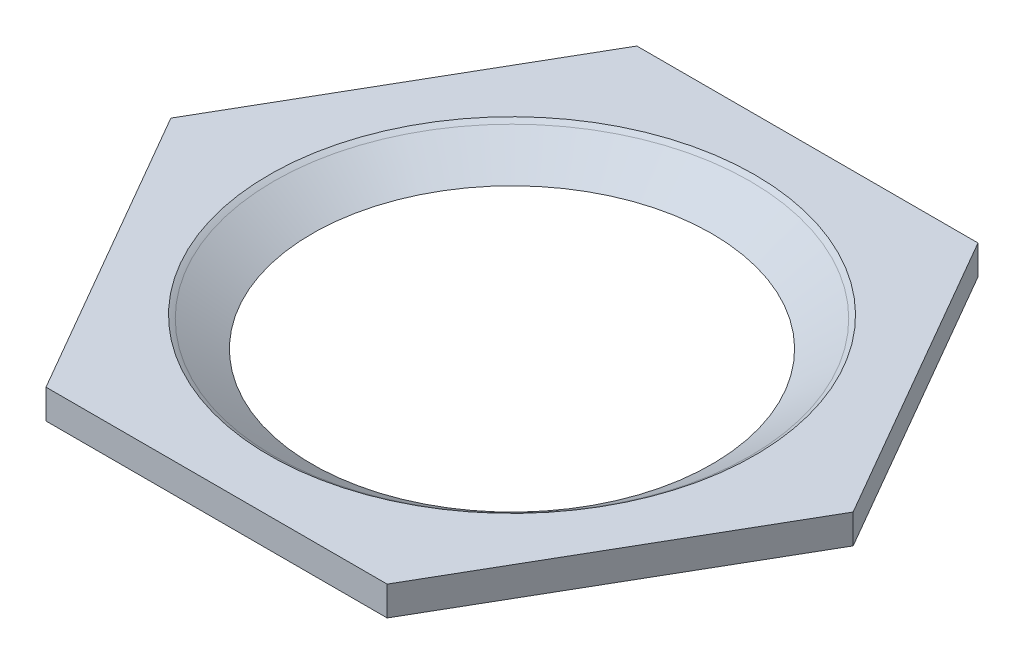
ISO-10303-21;
HEADER;
FILE_DESCRIPTION(('STEP AP214'),'2;1');
FILE_NAME('part.step','',(''),(''),'','','');
FILE_SCHEMA(('AUTOMOTIVE_DESIGN { 1 0 10303 214 1 1 1 1 }'));
ENDSEC;
DATA;
#1=APPLICATION_CONTEXT('core data for automotive mechanical design processes');
#2=APPLICATION_PROTOCOL_DEFINITION('international standard','automotive_design',2000,#1);
#3=PRODUCT_CONTEXT('',#1,'mechanical');
#4=PRODUCT('Part','Part','',(#3));
#5=PRODUCT_RELATED_PRODUCT_CATEGORY('part','',(#4));
#6=PRODUCT_DEFINITION_FORMATION('','',#4);
#7=PRODUCT_DEFINITION_CONTEXT('part definition',#1,'design');
#8=PRODUCT_DEFINITION('design','',#6,#7);
#9=PRODUCT_DEFINITION_SHAPE('','',#8);
#10=(LENGTH_UNIT() NAMED_UNIT(*) SI_UNIT(.MILLI.,.METRE.));
#11=(NAMED_UNIT(*) PLANE_ANGLE_UNIT() SI_UNIT($,.RADIAN.));
#12=(NAMED_UNIT(*) SI_UNIT($,.STERADIAN.) SOLID_ANGLE_UNIT());
#13=UNCERTAINTY_MEASURE_WITH_UNIT(LENGTH_MEASURE(1.E-05),#10,'distance_accuracy_value','');
#14=(GEOMETRIC_REPRESENTATION_CONTEXT(3) GLOBAL_UNCERTAINTY_ASSIGNED_CONTEXT((#13)) GLOBAL_UNIT_ASSIGNED_CONTEXT((#10,
#11,#12)) REPRESENTATION_CONTEXT('',''));
#15=CARTESIAN_POINT('',(0.,0.,0.));
#16=DIRECTION('',(0.,0.,1.));
#17=DIRECTION('',(1.,0.,0.));
#18=AXIS2_PLACEMENT_3D('',#15,#16,#17);
#19=CARTESIAN_POINT('',(11.0718461122495,66.3956,-19.177));
#20=DIRECTION('',(-0.866025403784439,0.,0.5));
#21=DIRECTION('',(0.5,0.,0.866025403784439));
#22=AXIS2_PLACEMENT_3D('',#19,#20,#21);
#23=PLANE('',#22);
#24=DIRECTION('',(-0.5,0.,-0.866025403784439));
#25=VECTOR('',#24,1.);
#26=CARTESIAN_POINT('',(11.0718461122495,64.4906,-19.177));
#27=LINE('',#26,#25);
#28=CARTESIAN_POINT('',(22.1436922244989,64.4906,0.));
#29=VERTEX_POINT('',#28);
#30=CARTESIAN_POINT('',(11.0718461122495,64.4906,-19.177));
#31=VERTEX_POINT('',#30);
#32=EDGE_CURVE('E127',#29,#31,#27,.T.);
#33=ORIENTED_EDGE('',*,*,#32,.T.);
#34=DIRECTION('',(0.,-1.,0.));
#35=VECTOR('',#34,1.);
#36=CARTESIAN_POINT('',(11.0718461122495,66.3956,-19.177));
#37=LINE('',#36,#35);
#38=CARTESIAN_POINT('',(11.0718461122495,66.3956,-19.177));
#39=VERTEX_POINT('',#38);
#40=EDGE_CURVE('E11',#39,#31,#37,.T.);
#41=ORIENTED_EDGE('',*,*,#40,.F.);
#42=DIRECTION('',(-0.5,0.,-0.866025403784439));
#43=VECTOR('',#42,1.);
#44=CARTESIAN_POINT('',(11.0718461122495,66.3956,-19.177));
#45=LINE('',#44,#43);
#46=CARTESIAN_POINT('',(22.1436922244989,66.3956,0.));
#47=VERTEX_POINT('',#46);
#48=EDGE_CURVE('E138',#47,#39,#45,.T.);
#49=ORIENTED_EDGE('',*,*,#48,.F.);
#50=DIRECTION('',(0.,-1.,0.));
#51=VECTOR('',#50,1.);
#52=CARTESIAN_POINT('',(22.1436922244989,66.3956,0.));
#53=LINE('',#52,#51);
#54=EDGE_CURVE('E123',#47,#29,#53,.T.);
#55=ORIENTED_EDGE('',*,*,#54,.T.);
#56=EDGE_LOOP('',(#33,#41,#49,#55));
#57=FACE_BOUND('',#56,.T.);
#58=ADVANCED_FACE('F43',(#57),#23,.F.);
#59=CARTESIAN_POINT('',(-11.0718461122495,66.3956,-19.177));
#60=DIRECTION('',(0.,0.,1.));
#61=DIRECTION('',(1.,0.,0.));
#62=AXIS2_PLACEMENT_3D('',#59,#60,#61);
#63=PLANE('',#62);
#64=DIRECTION('',(-1.,0.,0.));
#65=VECTOR('',#64,1.);
#66=CARTESIAN_POINT('',(-11.0718461122495,64.4906,-19.177));
#67=LINE('',#66,#65);
#68=CARTESIAN_POINT('',(-11.0718461122495,64.4906,-19.177));
#69=VERTEX_POINT('',#68);
#70=EDGE_CURVE('E130',#31,#69,#67,.T.);
#71=ORIENTED_EDGE('',*,*,#70,.T.);
#72=DIRECTION('',(0.,-1.,0.));
#73=VECTOR('',#72,1.);
#74=CARTESIAN_POINT('',(-11.0718461122495,66.3956,-19.177));
#75=LINE('',#74,#73);
#76=CARTESIAN_POINT('',(-11.0718461122495,66.3956,-19.177));
#77=VERTEX_POINT('',#76);
#78=EDGE_CURVE('E51',#77,#69,#75,.T.);
#79=ORIENTED_EDGE('',*,*,#78,.F.);
#80=DIRECTION('',(-1.,0.,0.));
#81=VECTOR('',#80,1.);
#82=CARTESIAN_POINT('',(-11.0718461122495,66.3956,-19.177));
#83=LINE('',#82,#81);
#84=EDGE_CURVE('E96',#39,#77,#83,.T.);
#85=ORIENTED_EDGE('',*,*,#84,.F.);
#86=ORIENTED_EDGE('',*,*,#40,.T.);
#87=EDGE_LOOP('',(#71,#79,#85,#86));
#88=FACE_BOUND('',#87,.T.);
#89=ADVANCED_FACE('F163',(#88),#63,.F.);
#90=CARTESIAN_POINT('',(-22.1436922244989,66.3956,0.));
#91=DIRECTION('',(0.866025403784439,0.,0.5));
#92=DIRECTION('',(0.5,0.,-0.866025403784439));
#93=AXIS2_PLACEMENT_3D('',#90,#91,#92);
#94=PLANE('',#93);
#95=DIRECTION('',(-0.5,0.,0.866025403784439));
#96=VECTOR('',#95,1.);
#97=CARTESIAN_POINT('',(-22.1436922244989,64.4906,0.));
#98=LINE('',#97,#96);
#99=CARTESIAN_POINT('',(-22.1436922244989,64.4906,0.));
#100=VERTEX_POINT('',#99);
#101=EDGE_CURVE('E133',#69,#100,#98,.T.);
#102=ORIENTED_EDGE('',*,*,#101,.T.);
#103=DIRECTION('',(0.,-1.,0.));
#104=VECTOR('',#103,1.);
#105=CARTESIAN_POINT('',(-22.1436922244989,66.3956,0.));
#106=LINE('',#105,#104);
#107=CARTESIAN_POINT('',(-22.1436922244989,66.3956,0.));
#108=VERTEX_POINT('',#107);
#109=EDGE_CURVE('E118',#108,#100,#106,.T.);
#110=ORIENTED_EDGE('',*,*,#109,.F.);
#111=DIRECTION('',(-0.5,0.,0.866025403784439));
#112=VECTOR('',#111,1.);
#113=CARTESIAN_POINT('',(-22.1436922244989,66.3956,0.));
#114=LINE('',#113,#112);
#115=EDGE_CURVE('E109',#77,#108,#114,.T.);
#116=ORIENTED_EDGE('',*,*,#115,.F.);
#117=ORIENTED_EDGE('',*,*,#78,.T.);
#118=EDGE_LOOP('',(#102,#110,#116,#117));
#119=FACE_BOUND('',#118,.T.);
#120=ADVANCED_FACE('F144',(#119),#94,.F.);
#121=CARTESIAN_POINT('',(-11.0718461122494,66.3956,19.177));
#122=DIRECTION('',(0.866025403784439,0.,-0.5));
#123=DIRECTION('',(-0.5,0.,-0.866025403784439));
#124=AXIS2_PLACEMENT_3D('',#121,#122,#123);
#125=PLANE('',#124);
#126=DIRECTION('',(0.5,0.,0.866025403784439));
#127=VECTOR('',#126,1.);
#128=CARTESIAN_POINT('',(-11.0718461122494,64.4906,19.177));
#129=LINE('',#128,#127);
#130=CARTESIAN_POINT('',(-11.0718461122494,64.4906,19.177));
#131=VERTEX_POINT('',#130);
#132=EDGE_CURVE('E117',#100,#131,#129,.T.);
#133=ORIENTED_EDGE('',*,*,#132,.T.);
#134=DIRECTION('',(0.,-1.,0.));
#135=VECTOR('',#134,1.);
#136=CARTESIAN_POINT('',(-11.0718461122494,66.3956,19.177));
#137=LINE('',#136,#135);
#138=CARTESIAN_POINT('',(-11.0718461122494,66.3956,19.177));
#139=VERTEX_POINT('',#138);
#140=EDGE_CURVE('E114',#139,#131,#137,.T.);
#141=ORIENTED_EDGE('',*,*,#140,.F.);
#142=DIRECTION('',(0.5,0.,0.866025403784439));
#143=VECTOR('',#142,1.);
#144=CARTESIAN_POINT('',(-11.0718461122494,66.3956,19.177));
#145=LINE('',#144,#143);
#146=EDGE_CURVE('E103',#108,#139,#145,.T.);
#147=ORIENTED_EDGE('',*,*,#146,.F.);
#148=ORIENTED_EDGE('',*,*,#109,.T.);
#149=EDGE_LOOP('',(#133,#141,#147,#148));
#150=FACE_BOUND('',#149,.T.);
#151=ADVANCED_FACE('F115',(#150),#125,.F.);
#152=CARTESIAN_POINT('',(11.0718461122495,66.3956,19.177));
#153=DIRECTION('',(0.,0.,-1.));
#154=DIRECTION('',(-1.,0.,0.));
#155=AXIS2_PLACEMENT_3D('',#152,#153,#154);
#156=PLANE('',#155);
#157=DIRECTION('',(1.,0.,0.));
#158=VECTOR('',#157,1.);
#159=CARTESIAN_POINT('',(11.0718461122495,64.4906,19.177));
#160=LINE('',#159,#158);
#161=CARTESIAN_POINT('',(11.0718461122495,64.4906,19.177));
#162=VERTEX_POINT('',#161);
#163=EDGE_CURVE('E82',#131,#162,#160,.T.);
#164=ORIENTED_EDGE('',*,*,#163,.T.);
#165=DIRECTION('',(0.,-1.,0.));
#166=VECTOR('',#165,1.);
#167=CARTESIAN_POINT('',(11.0718461122495,66.3956,19.177));
#168=LINE('',#167,#166);
#169=CARTESIAN_POINT('',(11.0718461122495,66.3956,19.177));
#170=VERTEX_POINT('',#169);
#171=EDGE_CURVE('E119',#170,#162,#168,.T.);
#172=ORIENTED_EDGE('',*,*,#171,.F.);
#173=DIRECTION('',(1.,0.,0.));
#174=VECTOR('',#173,1.);
#175=CARTESIAN_POINT('',(11.0718461122495,66.3956,19.177));
#176=LINE('',#175,#174);
#177=EDGE_CURVE('E107',#139,#170,#176,.T.);
#178=ORIENTED_EDGE('',*,*,#177,.F.);
#179=ORIENTED_EDGE('',*,*,#140,.T.);
#180=EDGE_LOOP('',(#164,#172,#178,#179));
#181=FACE_BOUND('',#180,.T.);
#182=ADVANCED_FACE('F121',(#181),#156,.F.);
#183=CARTESIAN_POINT('',(22.1436922244989,66.3956,0.));
#184=DIRECTION('',(-0.866025403784439,0.,-0.5));
#185=DIRECTION('',(-0.5,0.,0.866025403784439));
#186=AXIS2_PLACEMENT_3D('',#183,#184,#185);
#187=PLANE('',#186);
#188=DIRECTION('',(0.5,0.,-0.866025403784439));
#189=VECTOR('',#188,1.);
#190=CARTESIAN_POINT('',(22.1436922244989,64.4906,0.));
#191=LINE('',#190,#189);
#192=EDGE_CURVE('E88',#162,#29,#191,.T.);
#193=ORIENTED_EDGE('',*,*,#192,.T.);
#194=ORIENTED_EDGE('',*,*,#54,.F.);
#195=DIRECTION('',(0.5,0.,-0.866025403784439));
#196=VECTOR('',#195,1.);
#197=CARTESIAN_POINT('',(22.1436922244989,66.3956,0.));
#198=LINE('',#197,#196);
#199=EDGE_CURVE('E59',#170,#47,#198,.T.);
#200=ORIENTED_EDGE('',*,*,#199,.F.);
#201=ORIENTED_EDGE('',*,*,#171,.T.);
#202=EDGE_LOOP('',(#193,#194,#200,#201));
#203=FACE_BOUND('',#202,.T.);
#204=ADVANCED_FACE('F151',(#203),#187,.F.);
#205=CARTESIAN_POINT('',(0.,66.3956,0.));
#206=DIRECTION('',(0.,-1.,0.));
#207=DIRECTION('',(0.,0.,-1.));
#208=AXIS2_PLACEMENT_3D('',#205,#206,#207);
#209=PLANE('',#208);
#210=CARTESIAN_POINT('',(0.,66.3956,0.));
#211=DIRECTION('',(0.,-1.,0.));
#212=DIRECTION('',(0.,0.,-1.));
#213=AXIS2_PLACEMENT_3D('',#210,#211,#212);
#214=CIRCLE('',#213,15.76832);
#215=CARTESIAN_POINT('',(0.,66.3956,-15.76832));
#216=VERTEX_POINT('',#215);
#217=EDGE_CURVE('E131',#216,#216,#214,.T.);
#218=ORIENTED_EDGE('',*,*,#217,.T.);
#219=EDGE_LOOP('',(#218));
#220=FACE_BOUND('',#219,.T.);
#221=ORIENTED_EDGE('',*,*,#48,.T.);
#222=ORIENTED_EDGE('',*,*,#84,.T.);
#223=ORIENTED_EDGE('',*,*,#115,.T.);
#224=ORIENTED_EDGE('',*,*,#146,.T.);
#225=ORIENTED_EDGE('',*,*,#177,.T.);
#226=ORIENTED_EDGE('',*,*,#199,.T.);
#227=EDGE_LOOP('',(#221,#222,#223,#224,#225,#226));
#228=FACE_BOUND('',#227,.T.);
#229=ADVANCED_FACE('F105',(#220,#228),#209,.F.);
#230=CARTESIAN_POINT('',(0.,64.4906,0.));
#231=DIRECTION('',(0.,-1.,0.));
#232=DIRECTION('',(0.,0.,-1.));
#233=AXIS2_PLACEMENT_3D('',#230,#231,#232);
#234=PLANE('',#233);
#235=CARTESIAN_POINT('',(0.,64.4906,0.));
#236=DIRECTION('',(0.,-1.,0.));
#237=DIRECTION('',(0.,0.,-1.));
#238=AXIS2_PLACEMENT_3D('',#235,#236,#237);
#239=CIRCLE('',#238,12.97178);
#240=CARTESIAN_POINT('',(0.,64.4906,-12.97178));
#241=VERTEX_POINT('',#240);
#242=EDGE_CURVE('E230',#241,#241,#239,.T.);
#243=ORIENTED_EDGE('',*,*,#242,.F.);
#244=EDGE_LOOP('',(#243));
#245=FACE_BOUND('',#244,.T.);
#246=ORIENTED_EDGE('',*,*,#32,.F.);
#247=ORIENTED_EDGE('',*,*,#192,.F.);
#248=ORIENTED_EDGE('',*,*,#163,.F.);
#249=ORIENTED_EDGE('',*,*,#132,.F.);
#250=ORIENTED_EDGE('',*,*,#101,.F.);
#251=ORIENTED_EDGE('',*,*,#70,.F.);
#252=EDGE_LOOP('',(#246,#247,#248,#249,#250,#251));
#253=FACE_BOUND('',#252,.T.);
#254=ADVANCED_FACE('F147',(#245,#253),#234,.T.);
#255=CARTESIAN_POINT('',(0.,60.7890746218891,0.));
#256=DIRECTION('',(0.,-1.,0.));
#257=DIRECTION('',(0.,0.,-1.));
#258=AXIS2_PLACEMENT_3D('',#255,#256,#257);
#259=TOROIDAL_SURFACE('',#258,19.1636791622105,6.55450918496639);
#260=ORIENTED_EDGE('',*,*,#217,.F.);
#261=EDGE_LOOP('',(#260));
#262=FACE_BOUND('',#261,.T.);
#263=CARTESIAN_POINT('',(0.,66.19494,0.));
#264=DIRECTION('',(0.,-1.,0.));
#265=DIRECTION('',(0.,0.,-1.));
#266=AXIS2_PLACEMENT_3D('',#263,#264,#265);
#267=CIRCLE('',#266,15.45717);
#268=CARTESIAN_POINT('',(0.,66.19494,-15.45717));
#269=VERTEX_POINT('',#268);
#270=EDGE_CURVE('E227',#269,#269,#267,.T.);
#271=ORIENTED_EDGE('',*,*,#270,.T.);
#272=EDGE_LOOP('',(#271));
#273=FACE_BOUND('',#272,.T.);
#274=ADVANCED_FACE('F202',(#262,#273),#259,.T.);
#275=CARTESIAN_POINT('',(0.,64.4906,0.));
#276=DIRECTION('',(0.,1.,0.));
#277=DIRECTION('',(0.,0.,1.));
#278=AXIS2_PLACEMENT_3D('',#275,#276,#277);
#279=CONICAL_SURFACE('',#278,12.97178,0.969702711915633);
#280=ORIENTED_EDGE('',*,*,#270,.F.);
#281=EDGE_LOOP('',(#280));
#282=FACE_BOUND('',#281,.T.);
#283=ORIENTED_EDGE('',*,*,#242,.T.);
#284=EDGE_LOOP('',(#283));
#285=FACE_BOUND('',#284,.T.);
#286=ADVANCED_FACE('F211',(#282,#285),#279,.F.);
#287=CLOSED_SHELL('',(#58,#89,#120,#151,#182,#204,#229,#254,#274,#286));
#288=MANIFOLD_SOLID_BREP('B2',#287);
#289=ADVANCED_BREP_SHAPE_REPRESENTATION('',(#18,#288),#14);
#290=SHAPE_DEFINITION_REPRESENTATION(#9,#289);
ENDSEC;
END-ISO-10303-21;
